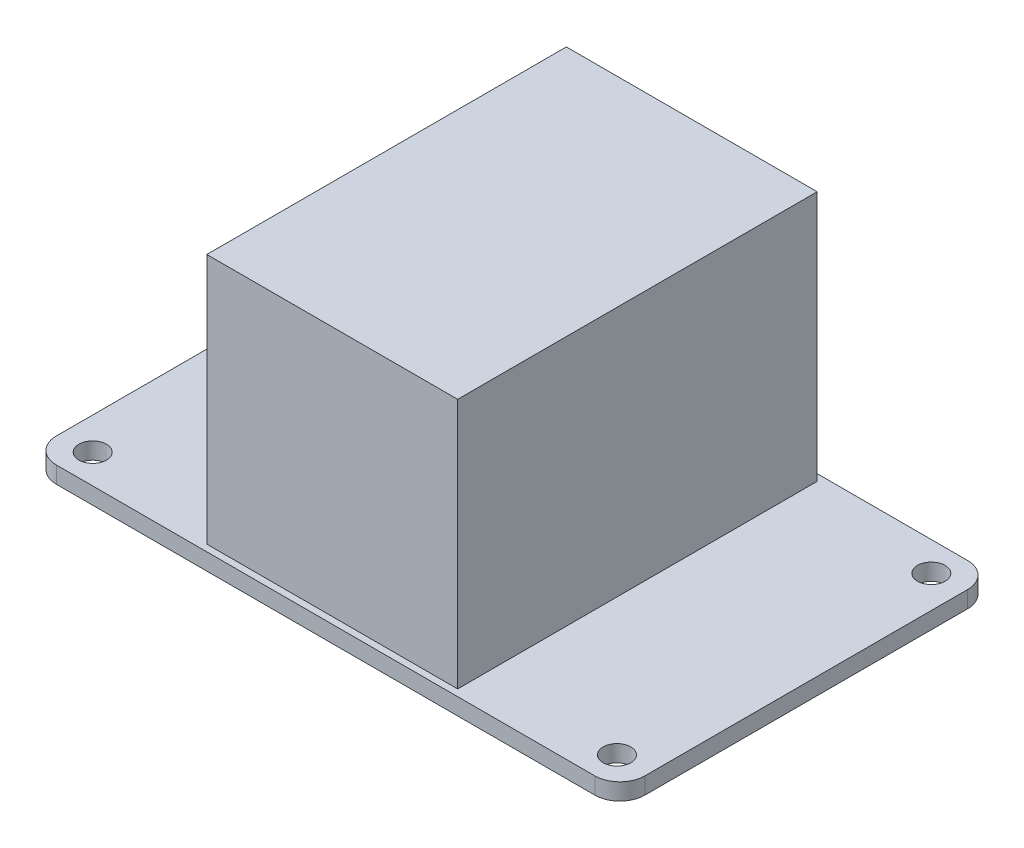
ISO-10303-21;
HEADER;
FILE_DESCRIPTION(('STEP AP214'),'2;1');
FILE_NAME('part.step','',(''),(''),'','','');
FILE_SCHEMA(('AUTOMOTIVE_DESIGN { 1 0 10303 214 1 1 1 1 }'));
ENDSEC;
DATA;
#1=APPLICATION_CONTEXT('core data for automotive mechanical design processes');
#2=APPLICATION_PROTOCOL_DEFINITION('international standard','automotive_design',2000,#1);
#3=PRODUCT_CONTEXT('',#1,'mechanical');
#4=PRODUCT('Part','Part','',(#3));
#5=PRODUCT_RELATED_PRODUCT_CATEGORY('part','',(#4));
#6=PRODUCT_DEFINITION_FORMATION('','',#4);
#7=PRODUCT_DEFINITION_CONTEXT('part definition',#1,'design');
#8=PRODUCT_DEFINITION('design','',#6,#7);
#9=PRODUCT_DEFINITION_SHAPE('','',#8);
#10=(LENGTH_UNIT() NAMED_UNIT(*) SI_UNIT(.MILLI.,.METRE.));
#11=(NAMED_UNIT(*) PLANE_ANGLE_UNIT() SI_UNIT($,.RADIAN.));
#12=(NAMED_UNIT(*) SI_UNIT($,.STERADIAN.) SOLID_ANGLE_UNIT());
#13=UNCERTAINTY_MEASURE_WITH_UNIT(LENGTH_MEASURE(1.E-05),#10,'distance_accuracy_value','');
#14=(GEOMETRIC_REPRESENTATION_CONTEXT(3) GLOBAL_UNCERTAINTY_ASSIGNED_CONTEXT((#13)) GLOBAL_UNIT_ASSIGNED_CONTEXT((#10,
#11,#12)) REPRESENTATION_CONTEXT('',''));
#15=CARTESIAN_POINT('',(0.,0.,0.));
#16=DIRECTION('',(0.,0.,1.));
#17=DIRECTION('',(1.,0.,0.));
#18=AXIS2_PLACEMENT_3D('',#15,#16,#17);
#19=CARTESIAN_POINT('',(0.,2.,0.));
#20=DIRECTION('',(0.,-1.,0.));
#21=DIRECTION('',(0.,0.,-1.));
#22=AXIS2_PLACEMENT_3D('',#19,#20,#21);
#23=PLANE('',#22);
#24=DIRECTION('',(0.,0.,-1.));
#25=VECTOR('',#24,1.);
#26=CARTESIAN_POINT('',(35.2,2.,22.3));
#27=LINE('',#26,#25);
#28=CARTESIAN_POINT('',(35.2,2.,19.3));
#29=VERTEX_POINT('',#28);
#30=CARTESIAN_POINT('',(35.2,2.,-19.3));
#31=VERTEX_POINT('',#30);
#32=EDGE_CURVE('E179',#29,#31,#27,.T.);
#33=ORIENTED_EDGE('',*,*,#32,.T.);
#34=CARTESIAN_POINT('',(32.2,2.,-19.3));
#35=DIRECTION('',(0.,-1.,0.));
#36=DIRECTION('',(0.,0.,-1.));
#37=AXIS2_PLACEMENT_3D('',#34,#35,#36);
#38=CIRCLE('',#37,3.);
#39=CARTESIAN_POINT('',(32.2,2.,-22.3));
#40=VERTEX_POINT('',#39);
#41=EDGE_CURVE('E226',#31,#40,#38,.F.);
#42=ORIENTED_EDGE('',*,*,#41,.T.);
#43=DIRECTION('',(-1.,0.,0.));
#44=VECTOR('',#43,1.);
#45=CARTESIAN_POINT('',(-35.2,2.,-22.3));
#46=LINE('',#45,#44);
#47=CARTESIAN_POINT('',(-32.2,2.,-22.3));
#48=VERTEX_POINT('',#47);
#49=EDGE_CURVE('E182',#40,#48,#46,.T.);
#50=ORIENTED_EDGE('',*,*,#49,.T.);
#51=CARTESIAN_POINT('',(-32.2,2.,-19.3));
#52=DIRECTION('',(0.,-1.,0.));
#53=DIRECTION('',(0.,0.,-1.));
#54=AXIS2_PLACEMENT_3D('',#51,#52,#53);
#55=CIRCLE('',#54,3.);
#56=CARTESIAN_POINT('',(-35.2,2.,-19.3));
#57=VERTEX_POINT('',#56);
#58=EDGE_CURVE('E222',#48,#57,#55,.F.);
#59=ORIENTED_EDGE('',*,*,#58,.T.);
#60=DIRECTION('',(0.,0.,1.));
#61=VECTOR('',#60,1.);
#62=CARTESIAN_POINT('',(-35.2,2.,22.3));
#63=LINE('',#62,#61);
#64=CARTESIAN_POINT('',(-35.2,2.,19.3));
#65=VERTEX_POINT('',#64);
#66=EDGE_CURVE('E186',#57,#65,#63,.T.);
#67=ORIENTED_EDGE('',*,*,#66,.T.);
#68=CARTESIAN_POINT('',(-32.2,2.,19.3));
#69=DIRECTION('',(0.,-1.,0.));
#70=DIRECTION('',(0.,0.,-1.));
#71=AXIS2_PLACEMENT_3D('',#68,#69,#70);
#72=CIRCLE('',#71,3.);
#73=CARTESIAN_POINT('',(-32.2,2.,22.3));
#74=VERTEX_POINT('',#73);
#75=EDGE_CURVE('E220',#65,#74,#72,.F.);
#76=ORIENTED_EDGE('',*,*,#75,.T.);
#77=DIRECTION('',(1.,0.,0.));
#78=VECTOR('',#77,1.);
#79=CARTESIAN_POINT('',(-35.2,2.,22.3));
#80=LINE('',#79,#78);
#81=CARTESIAN_POINT('',(32.2,2.,22.3));
#82=VERTEX_POINT('',#81);
#83=EDGE_CURVE('E189',#74,#82,#80,.T.);
#84=ORIENTED_EDGE('',*,*,#83,.T.);
#85=CARTESIAN_POINT('',(32.2,2.,19.3));
#86=DIRECTION('',(0.,-1.,0.));
#87=DIRECTION('',(0.,0.,-1.));
#88=AXIS2_PLACEMENT_3D('',#85,#86,#87);
#89=CIRCLE('',#88,3.);
#90=EDGE_CURVE('E224',#82,#29,#89,.F.);
#91=ORIENTED_EDGE('',*,*,#90,.T.);
#92=EDGE_LOOP('',(#33,#42,#50,#59,#67,#76,#84,#91));
#93=FACE_BOUND('',#92,.T.);
#94=CARTESIAN_POINT('',(-31.35,2.,-18.8));
#95=DIRECTION('',(0.,1.,0.));
#96=DIRECTION('',(0.,0.,1.));
#97=AXIS2_PLACEMENT_3D('',#94,#95,#96);
#98=CIRCLE('',#97,1.65);
#99=CARTESIAN_POINT('',(-31.35,2.,-17.15));
#100=VERTEX_POINT('',#99);
#101=EDGE_CURVE('E161',#100,#100,#98,.T.);
#102=ORIENTED_EDGE('',*,*,#101,.F.);
#103=EDGE_LOOP('',(#102));
#104=FACE_BOUND('',#103,.T.);
#105=CARTESIAN_POINT('',(31.35,2.,-18.8));
#106=DIRECTION('',(0.,1.,0.));
#107=DIRECTION('',(0.,0.,1.));
#108=AXIS2_PLACEMENT_3D('',#105,#106,#107);
#109=CIRCLE('',#108,1.65);
#110=CARTESIAN_POINT('',(31.35,2.,-17.15));
#111=VERTEX_POINT('',#110);
#112=EDGE_CURVE('E162',#111,#111,#109,.T.);
#113=ORIENTED_EDGE('',*,*,#112,.F.);
#114=EDGE_LOOP('',(#113));
#115=FACE_BOUND('',#114,.T.);
#116=CARTESIAN_POINT('',(31.35,2.,18.8));
#117=DIRECTION('',(0.,1.,0.));
#118=DIRECTION('',(0.,0.,1.));
#119=AXIS2_PLACEMENT_3D('',#116,#117,#118);
#120=CIRCLE('',#119,1.65);
#121=CARTESIAN_POINT('',(31.35,2.,20.45));
#122=VERTEX_POINT('',#121);
#123=EDGE_CURVE('E168',#122,#122,#120,.T.);
#124=ORIENTED_EDGE('',*,*,#123,.F.);
#125=EDGE_LOOP('',(#124));
#126=FACE_BOUND('',#125,.T.);
#127=CARTESIAN_POINT('',(-31.35,2.,18.8));
#128=DIRECTION('',(0.,1.,0.));
#129=DIRECTION('',(0.,0.,1.));
#130=AXIS2_PLACEMENT_3D('',#127,#128,#129);
#131=CIRCLE('',#130,1.65);
#132=CARTESIAN_POINT('',(-31.35,2.,20.45));
#133=VERTEX_POINT('',#132);
#134=EDGE_CURVE('E149',#133,#133,#131,.T.);
#135=ORIENTED_EDGE('',*,*,#134,.F.);
#136=EDGE_LOOP('',(#135));
#137=FACE_BOUND('',#136,.T.);
#138=DIRECTION('',(0.,0.,-1.));
#139=VECTOR('',#138,1.);
#140=CARTESIAN_POINT('',(15.,2.,21.5));
#141=LINE('',#140,#139);
#142=CARTESIAN_POINT('',(15.,2.,21.5));
#143=VERTEX_POINT('',#142);
#144=CARTESIAN_POINT('',(15.,2.,-21.5));
#145=VERTEX_POINT('',#144);
#146=EDGE_CURVE('E148',#143,#145,#141,.T.);
#147=ORIENTED_EDGE('',*,*,#146,.F.);
#148=DIRECTION('',(1.,0.,0.));
#149=VECTOR('',#148,1.);
#150=CARTESIAN_POINT('',(-15.,2.,21.5));
#151=LINE('',#150,#149);
#152=CARTESIAN_POINT('',(-15.,2.,21.5));
#153=VERTEX_POINT('',#152);
#154=EDGE_CURVE('E145',#153,#143,#151,.T.);
#155=ORIENTED_EDGE('',*,*,#154,.F.);
#156=DIRECTION('',(0.,0.,1.));
#157=VECTOR('',#156,1.);
#158=CARTESIAN_POINT('',(-15.,2.,21.5));
#159=LINE('',#158,#157);
#160=CARTESIAN_POINT('',(-15.,2.,-21.5));
#161=VERTEX_POINT('',#160);
#162=EDGE_CURVE('E59',#161,#153,#159,.T.);
#163=ORIENTED_EDGE('',*,*,#162,.F.);
#164=DIRECTION('',(-1.,0.,0.));
#165=VECTOR('',#164,1.);
#166=CARTESIAN_POINT('',(-15.,2.,-21.5));
#167=LINE('',#166,#165);
#168=EDGE_CURVE('E54',#145,#161,#167,.T.);
#169=ORIENTED_EDGE('',*,*,#168,.F.);
#170=EDGE_LOOP('',(#147,#155,#163,#169));
#171=FACE_BOUND('',#170,.T.);
#172=ADVANCED_FACE('F39',(#93,#104,#115,#126,#137,#171),#23,.F.);
#173=CARTESIAN_POINT('',(35.2,2.,22.3));
#174=DIRECTION('',(-1.,0.,0.));
#175=DIRECTION('',(0.,0.,1.));
#176=AXIS2_PLACEMENT_3D('',#173,#174,#175);
#177=PLANE('',#176);
#178=DIRECTION('',(0.,0.,-1.));
#179=VECTOR('',#178,1.);
#180=CARTESIAN_POINT('',(35.2,0.,22.3));
#181=LINE('',#180,#179);
#182=CARTESIAN_POINT('',(35.2,0.,19.3));
#183=VERTEX_POINT('',#182);
#184=CARTESIAN_POINT('',(35.2,0.,-19.3));
#185=VERTEX_POINT('',#184);
#186=EDGE_CURVE('E176',#183,#185,#181,.T.);
#187=ORIENTED_EDGE('',*,*,#186,.T.);
#188=DIRECTION('',(0.,-1.,0.));
#189=VECTOR('',#188,1.);
#190=CARTESIAN_POINT('',(35.2,2.,-19.3));
#191=LINE('',#190,#189);
#192=EDGE_CURVE('E218',#185,#31,#191,.F.);
#193=ORIENTED_EDGE('',*,*,#192,.T.);
#194=ORIENTED_EDGE('',*,*,#32,.F.);
#195=DIRECTION('',(0.,-1.,0.));
#196=VECTOR('',#195,1.);
#197=CARTESIAN_POINT('',(35.2,2.,19.3));
#198=LINE('',#197,#196);
#199=EDGE_CURVE('E215',#29,#183,#198,.T.);
#200=ORIENTED_EDGE('',*,*,#199,.T.);
#201=EDGE_LOOP('',(#187,#193,#194,#200));
#202=FACE_BOUND('',#201,.T.);
#203=ADVANCED_FACE('F259',(#202),#177,.F.);
#204=CARTESIAN_POINT('',(-35.2,2.,-22.3));
#205=DIRECTION('',(0.,0.,1.));
#206=DIRECTION('',(1.,0.,0.));
#207=AXIS2_PLACEMENT_3D('',#204,#205,#206);
#208=PLANE('',#207);
#209=ORIENTED_EDGE('',*,*,#49,.F.);
#210=DIRECTION('',(0.,-1.,0.));
#211=VECTOR('',#210,1.);
#212=CARTESIAN_POINT('',(32.2,2.,-22.3));
#213=LINE('',#212,#211);
#214=CARTESIAN_POINT('',(32.2,0.,-22.3));
#215=VERTEX_POINT('',#214);
#216=EDGE_CURVE('E204',#40,#215,#213,.T.);
#217=ORIENTED_EDGE('',*,*,#216,.T.);
#218=DIRECTION('',(-1.,0.,0.));
#219=VECTOR('',#218,1.);
#220=CARTESIAN_POINT('',(-35.2,0.,-22.3));
#221=LINE('',#220,#219);
#222=CARTESIAN_POINT('',(-32.2,0.,-22.3));
#223=VERTEX_POINT('',#222);
#224=EDGE_CURVE('E195',#215,#223,#221,.T.);
#225=ORIENTED_EDGE('',*,*,#224,.T.);
#226=DIRECTION('',(0.,-1.,0.));
#227=VECTOR('',#226,1.);
#228=CARTESIAN_POINT('',(-32.2,2.,-22.3));
#229=LINE('',#228,#227);
#230=EDGE_CURVE('E192',#223,#48,#229,.F.);
#231=ORIENTED_EDGE('',*,*,#230,.T.);
#232=EDGE_LOOP('',(#209,#217,#225,#231));
#233=FACE_BOUND('',#232,.T.);
#234=ADVANCED_FACE('F267',(#233),#208,.F.);
#235=CARTESIAN_POINT('',(-35.2,2.,22.3));
#236=DIRECTION('',(1.,0.,0.));
#237=DIRECTION('',(0.,0.,-1.));
#238=AXIS2_PLACEMENT_3D('',#235,#236,#237);
#239=PLANE('',#238);
#240=ORIENTED_EDGE('',*,*,#66,.F.);
#241=DIRECTION('',(0.,-1.,0.));
#242=VECTOR('',#241,1.);
#243=CARTESIAN_POINT('',(-35.2,2.,-19.3));
#244=LINE('',#243,#242);
#245=CARTESIAN_POINT('',(-35.2,0.,-19.3));
#246=VERTEX_POINT('',#245);
#247=EDGE_CURVE('E11',#57,#246,#244,.T.);
#248=ORIENTED_EDGE('',*,*,#247,.T.);
#249=DIRECTION('',(0.,0.,1.));
#250=VECTOR('',#249,1.);
#251=CARTESIAN_POINT('',(-35.2,0.,22.3));
#252=LINE('',#251,#250);
#253=CARTESIAN_POINT('',(-35.2,0.,19.3));
#254=VERTEX_POINT('',#253);
#255=EDGE_CURVE('E198',#246,#254,#252,.T.);
#256=ORIENTED_EDGE('',*,*,#255,.T.);
#257=DIRECTION('',(0.,-1.,0.));
#258=VECTOR('',#257,1.);
#259=CARTESIAN_POINT('',(-35.2,2.,19.3));
#260=LINE('',#259,#258);
#261=EDGE_CURVE('E47',#254,#65,#260,.F.);
#262=ORIENTED_EDGE('',*,*,#261,.T.);
#263=EDGE_LOOP('',(#240,#248,#256,#262));
#264=FACE_BOUND('',#263,.T.);
#265=ADVANCED_FACE('F235',(#264),#239,.F.);
#266=CARTESIAN_POINT('',(-35.2,2.,22.3));
#267=DIRECTION('',(0.,0.,-1.));
#268=DIRECTION('',(-1.,0.,0.));
#269=AXIS2_PLACEMENT_3D('',#266,#267,#268);
#270=PLANE('',#269);
#271=DIRECTION('',(1.,0.,0.));
#272=VECTOR('',#271,1.);
#273=CARTESIAN_POINT('',(-35.2,0.,22.3));
#274=LINE('',#273,#272);
#275=CARTESIAN_POINT('',(-32.2,0.,22.3));
#276=VERTEX_POINT('',#275);
#277=CARTESIAN_POINT('',(32.2,0.,22.3));
#278=VERTEX_POINT('',#277);
#279=EDGE_CURVE('E183',#276,#278,#274,.T.);
#280=ORIENTED_EDGE('',*,*,#279,.T.);
#281=DIRECTION('',(0.,-1.,0.));
#282=VECTOR('',#281,1.);
#283=CARTESIAN_POINT('',(32.2,2.,22.3));
#284=LINE('',#283,#282);
#285=EDGE_CURVE('E231',#278,#82,#284,.F.);
#286=ORIENTED_EDGE('',*,*,#285,.T.);
#287=ORIENTED_EDGE('',*,*,#83,.F.);
#288=DIRECTION('',(0.,-1.,0.));
#289=VECTOR('',#288,1.);
#290=CARTESIAN_POINT('',(-32.2,2.,22.3));
#291=LINE('',#290,#289);
#292=EDGE_CURVE('E228',#74,#276,#291,.T.);
#293=ORIENTED_EDGE('',*,*,#292,.T.);
#294=EDGE_LOOP('',(#280,#286,#287,#293));
#295=FACE_BOUND('',#294,.T.);
#296=ADVANCED_FACE('F247',(#295),#270,.F.);
#297=CARTESIAN_POINT('',(0.,0.,0.));
#298=DIRECTION('',(0.,-1.,0.));
#299=DIRECTION('',(0.,0.,-1.));
#300=AXIS2_PLACEMENT_3D('',#297,#298,#299);
#301=PLANE('',#300);
#302=CARTESIAN_POINT('',(-31.35,0.,18.8));
#303=DIRECTION('',(0.,1.,0.));
#304=DIRECTION('',(0.,0.,1.));
#305=AXIS2_PLACEMENT_3D('',#302,#303,#304);
#306=CIRCLE('',#305,1.65);
#307=CARTESIAN_POINT('',(-31.35,0.,20.45));
#308=VERTEX_POINT('',#307);
#309=EDGE_CURVE('E152',#308,#308,#306,.T.);
#310=ORIENTED_EDGE('',*,*,#309,.T.);
#311=EDGE_LOOP('',(#310));
#312=FACE_BOUND('',#311,.T.);
#313=CARTESIAN_POINT('',(31.35,0.,18.8));
#314=DIRECTION('',(0.,1.,0.));
#315=DIRECTION('',(0.,0.,1.));
#316=AXIS2_PLACEMENT_3D('',#313,#314,#315);
#317=CIRCLE('',#316,1.65);
#318=CARTESIAN_POINT('',(31.35,0.,20.45));
#319=VERTEX_POINT('',#318);
#320=EDGE_CURVE('E165',#319,#319,#317,.T.);
#321=ORIENTED_EDGE('',*,*,#320,.T.);
#322=EDGE_LOOP('',(#321));
#323=FACE_BOUND('',#322,.T.);
#324=CARTESIAN_POINT('',(31.35,0.,-18.8));
#325=DIRECTION('',(0.,1.,0.));
#326=DIRECTION('',(0.,0.,1.));
#327=AXIS2_PLACEMENT_3D('',#324,#325,#326);
#328=CIRCLE('',#327,1.65);
#329=CARTESIAN_POINT('',(31.35,0.,-17.15));
#330=VERTEX_POINT('',#329);
#331=EDGE_CURVE('E158',#330,#330,#328,.T.);
#332=ORIENTED_EDGE('',*,*,#331,.T.);
#333=EDGE_LOOP('',(#332));
#334=FACE_BOUND('',#333,.T.);
#335=CARTESIAN_POINT('',(-31.35,0.,-18.8));
#336=DIRECTION('',(0.,1.,0.));
#337=DIRECTION('',(0.,0.,1.));
#338=AXIS2_PLACEMENT_3D('',#335,#336,#337);
#339=CIRCLE('',#338,1.65);
#340=CARTESIAN_POINT('',(-31.35,0.,-17.15));
#341=VERTEX_POINT('',#340);
#342=EDGE_CURVE('E173',#341,#341,#339,.T.);
#343=ORIENTED_EDGE('',*,*,#342,.T.);
#344=EDGE_LOOP('',(#343));
#345=FACE_BOUND('',#344,.T.);
#346=ORIENTED_EDGE('',*,*,#224,.F.);
#347=CARTESIAN_POINT('',(32.2,0.,-19.3));
#348=DIRECTION('',(0.,-1.,0.));
#349=DIRECTION('',(0.,0.,-1.));
#350=AXIS2_PLACEMENT_3D('',#347,#348,#349);
#351=CIRCLE('',#350,3.);
#352=EDGE_CURVE('E213',#215,#185,#351,.T.);
#353=ORIENTED_EDGE('',*,*,#352,.T.);
#354=ORIENTED_EDGE('',*,*,#186,.F.);
#355=CARTESIAN_POINT('',(32.2,0.,19.3));
#356=DIRECTION('',(0.,-1.,0.));
#357=DIRECTION('',(0.,0.,-1.));
#358=AXIS2_PLACEMENT_3D('',#355,#356,#357);
#359=CIRCLE('',#358,3.);
#360=EDGE_CURVE('E211',#183,#278,#359,.T.);
#361=ORIENTED_EDGE('',*,*,#360,.T.);
#362=ORIENTED_EDGE('',*,*,#279,.F.);
#363=CARTESIAN_POINT('',(-32.2,0.,19.3));
#364=DIRECTION('',(0.,-1.,0.));
#365=DIRECTION('',(0.,0.,-1.));
#366=AXIS2_PLACEMENT_3D('',#363,#364,#365);
#367=CIRCLE('',#366,3.);
#368=EDGE_CURVE('E207',#276,#254,#367,.T.);
#369=ORIENTED_EDGE('',*,*,#368,.T.);
#370=ORIENTED_EDGE('',*,*,#255,.F.);
#371=CARTESIAN_POINT('',(-32.2,0.,-19.3));
#372=DIRECTION('',(0.,-1.,0.));
#373=DIRECTION('',(0.,0.,-1.));
#374=AXIS2_PLACEMENT_3D('',#371,#372,#373);
#375=CIRCLE('',#374,3.);
#376=EDGE_CURVE('E209',#246,#223,#375,.T.);
#377=ORIENTED_EDGE('',*,*,#376,.T.);
#378=EDGE_LOOP('',(#346,#353,#354,#361,#362,#369,#370,#377));
#379=FACE_BOUND('',#378,.T.);
#380=ADVANCED_FACE('F251',(#312,#323,#334,#345,#379),#301,.T.);
#381=CARTESIAN_POINT('',(-31.35,0.,-18.8));
#382=DIRECTION('',(0.,1.,0.));
#383=DIRECTION('',(0.,0.,1.));
#384=AXIS2_PLACEMENT_3D('',#381,#382,#383);
#385=CYLINDRICAL_SURFACE('',#384,1.65);
#386=ORIENTED_EDGE('',*,*,#342,.F.);
#387=EDGE_LOOP('',(#386));
#388=FACE_BOUND('',#387,.T.);
#389=ORIENTED_EDGE('',*,*,#101,.T.);
#390=EDGE_LOOP('',(#389));
#391=FACE_BOUND('',#390,.T.);
#392=ADVANCED_FACE('F286',(#388,#391),#385,.F.);
#393=CARTESIAN_POINT('',(31.35,0.,-18.8));
#394=DIRECTION('',(0.,1.,0.));
#395=DIRECTION('',(0.,0.,1.));
#396=AXIS2_PLACEMENT_3D('',#393,#394,#395);
#397=CYLINDRICAL_SURFACE('',#396,1.65);
#398=ORIENTED_EDGE('',*,*,#331,.F.);
#399=EDGE_LOOP('',(#398));
#400=FACE_BOUND('',#399,.T.);
#401=ORIENTED_EDGE('',*,*,#112,.T.);
#402=EDGE_LOOP('',(#401));
#403=FACE_BOUND('',#402,.T.);
#404=ADVANCED_FACE('F307',(#400,#403),#397,.F.);
#405=CARTESIAN_POINT('',(31.35,0.,18.8));
#406=DIRECTION('',(0.,1.,0.));
#407=DIRECTION('',(0.,0.,1.));
#408=AXIS2_PLACEMENT_3D('',#405,#406,#407);
#409=CYLINDRICAL_SURFACE('',#408,1.65);
#410=ORIENTED_EDGE('',*,*,#320,.F.);
#411=EDGE_LOOP('',(#410));
#412=FACE_BOUND('',#411,.T.);
#413=ORIENTED_EDGE('',*,*,#123,.T.);
#414=EDGE_LOOP('',(#413));
#415=FACE_BOUND('',#414,.T.);
#416=ADVANCED_FACE('F302',(#412,#415),#409,.F.);
#417=CARTESIAN_POINT('',(-31.35,0.,18.8));
#418=DIRECTION('',(0.,1.,0.));
#419=DIRECTION('',(0.,0.,1.));
#420=AXIS2_PLACEMENT_3D('',#417,#418,#419);
#421=CYLINDRICAL_SURFACE('',#420,1.65);
#422=ORIENTED_EDGE('',*,*,#309,.F.);
#423=EDGE_LOOP('',(#422));
#424=FACE_BOUND('',#423,.T.);
#425=ORIENTED_EDGE('',*,*,#134,.T.);
#426=EDGE_LOOP('',(#425));
#427=FACE_BOUND('',#426,.T.);
#428=ADVANCED_FACE('F298',(#424,#427),#421,.F.);
#429=CARTESIAN_POINT('',(32.2,2.,-19.3));
#430=DIRECTION('',(0.,-1.,0.));
#431=DIRECTION('',(0.,0.,-1.));
#432=AXIS2_PLACEMENT_3D('',#429,#430,#431);
#433=CYLINDRICAL_SURFACE('',#432,3.);
#434=ORIENTED_EDGE('',*,*,#41,.F.);
#435=ORIENTED_EDGE('',*,*,#192,.F.);
#436=ORIENTED_EDGE('',*,*,#352,.F.);
#437=ORIENTED_EDGE('',*,*,#216,.F.);
#438=EDGE_LOOP('',(#434,#435,#436,#437));
#439=FACE_BOUND('',#438,.T.);
#440=ADVANCED_FACE('F265',(#439),#433,.T.);
#441=CARTESIAN_POINT('',(32.2,2.,19.3));
#442=DIRECTION('',(0.,-1.,0.));
#443=DIRECTION('',(0.,0.,-1.));
#444=AXIS2_PLACEMENT_3D('',#441,#442,#443);
#445=CYLINDRICAL_SURFACE('',#444,3.);
#446=ORIENTED_EDGE('',*,*,#90,.F.);
#447=ORIENTED_EDGE('',*,*,#285,.F.);
#448=ORIENTED_EDGE('',*,*,#360,.F.);
#449=ORIENTED_EDGE('',*,*,#199,.F.);
#450=EDGE_LOOP('',(#446,#447,#448,#449));
#451=FACE_BOUND('',#450,.T.);
#452=ADVANCED_FACE('F256',(#451),#445,.T.);
#453=CARTESIAN_POINT('',(-32.2,2.,-19.3));
#454=DIRECTION('',(0.,-1.,0.));
#455=DIRECTION('',(0.,0.,-1.));
#456=AXIS2_PLACEMENT_3D('',#453,#454,#455);
#457=CYLINDRICAL_SURFACE('',#456,3.);
#458=ORIENTED_EDGE('',*,*,#58,.F.);
#459=ORIENTED_EDGE('',*,*,#230,.F.);
#460=ORIENTED_EDGE('',*,*,#376,.F.);
#461=ORIENTED_EDGE('',*,*,#247,.F.);
#462=EDGE_LOOP('',(#458,#459,#460,#461));
#463=FACE_BOUND('',#462,.T.);
#464=ADVANCED_FACE('F270',(#463),#457,.T.);
#465=CARTESIAN_POINT('',(-32.2,2.,19.3));
#466=DIRECTION('',(0.,-1.,0.));
#467=DIRECTION('',(0.,0.,-1.));
#468=AXIS2_PLACEMENT_3D('',#465,#466,#467);
#469=CYLINDRICAL_SURFACE('',#468,3.);
#470=ORIENTED_EDGE('',*,*,#75,.F.);
#471=ORIENTED_EDGE('',*,*,#261,.F.);
#472=ORIENTED_EDGE('',*,*,#368,.F.);
#473=ORIENTED_EDGE('',*,*,#292,.F.);
#474=EDGE_LOOP('',(#470,#471,#472,#473));
#475=FACE_BOUND('',#474,.T.);
#476=ADVANCED_FACE('F41',(#475),#469,.T.);
#477=CARTESIAN_POINT('',(15.,32.,21.5));
#478=DIRECTION('',(-1.,0.,0.));
#479=DIRECTION('',(0.,0.,1.));
#480=AXIS2_PLACEMENT_3D('',#477,#478,#479);
#481=PLANE('',#480);
#482=ORIENTED_EDGE('',*,*,#146,.T.);
#483=DIRECTION('',(0.,-1.,0.));
#484=VECTOR('',#483,1.);
#485=CARTESIAN_POINT('',(15.,32.,-21.5));
#486=LINE('',#485,#484);
#487=CARTESIAN_POINT('',(15.,32.,-21.5));
#488=VERTEX_POINT('',#487);
#489=EDGE_CURVE('E129',#488,#145,#486,.T.);
#490=ORIENTED_EDGE('',*,*,#489,.F.);
#491=DIRECTION('',(0.,0.,-1.));
#492=VECTOR('',#491,1.);
#493=CARTESIAN_POINT('',(15.,32.,21.5));
#494=LINE('',#493,#492);
#495=CARTESIAN_POINT('',(15.,32.,21.5));
#496=VERTEX_POINT('',#495);
#497=EDGE_CURVE('E136',#496,#488,#494,.T.);
#498=ORIENTED_EDGE('',*,*,#497,.F.);
#499=DIRECTION('',(0.,-1.,0.));
#500=VECTOR('',#499,1.);
#501=CARTESIAN_POINT('',(15.,32.,21.5));
#502=LINE('',#501,#500);
#503=EDGE_CURVE('E444',#496,#143,#502,.T.);
#504=ORIENTED_EDGE('',*,*,#503,.T.);
#505=EDGE_LOOP('',(#482,#490,#498,#504));
#506=FACE_BOUND('',#505,.T.);
#507=ADVANCED_FACE('F147',(#506),#481,.F.);
#508=CARTESIAN_POINT('',(-15.,32.,-21.5));
#509=DIRECTION('',(0.,0.,1.));
#510=DIRECTION('',(1.,0.,0.));
#511=AXIS2_PLACEMENT_3D('',#508,#509,#510);
#512=PLANE('',#511);
#513=ORIENTED_EDGE('',*,*,#168,.T.);
#514=DIRECTION('',(0.,-1.,0.));
#515=VECTOR('',#514,1.);
#516=CARTESIAN_POINT('',(-15.,32.,-21.5));
#517=LINE('',#516,#515);
#518=CARTESIAN_POINT('',(-15.,32.,-21.5));
#519=VERTEX_POINT('',#518);
#520=EDGE_CURVE('E132',#519,#161,#517,.T.);
#521=ORIENTED_EDGE('',*,*,#520,.F.);
#522=DIRECTION('',(-1.,0.,0.));
#523=VECTOR('',#522,1.);
#524=CARTESIAN_POINT('',(-15.,32.,-21.5));
#525=LINE('',#524,#523);
#526=EDGE_CURVE('E125',#488,#519,#525,.T.);
#527=ORIENTED_EDGE('',*,*,#526,.F.);
#528=ORIENTED_EDGE('',*,*,#489,.T.);
#529=EDGE_LOOP('',(#513,#521,#527,#528));
#530=FACE_BOUND('',#529,.T.);
#531=ADVANCED_FACE('F127',(#530),#512,.F.);
#532=CARTESIAN_POINT('',(-15.,32.,21.5));
#533=DIRECTION('',(1.,0.,0.));
#534=DIRECTION('',(0.,0.,-1.));
#535=AXIS2_PLACEMENT_3D('',#532,#533,#534);
#536=PLANE('',#535);
#537=ORIENTED_EDGE('',*,*,#162,.T.);
#538=DIRECTION('',(0.,-1.,0.));
#539=VECTOR('',#538,1.);
#540=CARTESIAN_POINT('',(-15.,32.,21.5));
#541=LINE('',#540,#539);
#542=CARTESIAN_POINT('',(-15.,32.,21.5));
#543=VERTEX_POINT('',#542);
#544=EDGE_CURVE('E154',#543,#153,#541,.T.);
#545=ORIENTED_EDGE('',*,*,#544,.F.);
#546=DIRECTION('',(0.,0.,1.));
#547=VECTOR('',#546,1.);
#548=CARTESIAN_POINT('',(-15.,32.,21.5));
#549=LINE('',#548,#547);
#550=EDGE_CURVE('E135',#519,#543,#549,.T.);
#551=ORIENTED_EDGE('',*,*,#550,.F.);
#552=ORIENTED_EDGE('',*,*,#520,.T.);
#553=EDGE_LOOP('',(#537,#545,#551,#552));
#554=FACE_BOUND('',#553,.T.);
#555=ADVANCED_FACE('F319',(#554),#536,.F.);
#556=CARTESIAN_POINT('',(-15.,32.,21.5));
#557=DIRECTION('',(0.,0.,-1.));
#558=DIRECTION('',(-1.,0.,0.));
#559=AXIS2_PLACEMENT_3D('',#556,#557,#558);
#560=PLANE('',#559);
#561=ORIENTED_EDGE('',*,*,#154,.T.);
#562=ORIENTED_EDGE('',*,*,#503,.F.);
#563=DIRECTION('',(1.,0.,0.));
#564=VECTOR('',#563,1.);
#565=CARTESIAN_POINT('',(-15.,32.,21.5));
#566=LINE('',#565,#564);
#567=EDGE_CURVE('E141',#543,#496,#566,.T.);
#568=ORIENTED_EDGE('',*,*,#567,.F.);
#569=ORIENTED_EDGE('',*,*,#544,.T.);
#570=EDGE_LOOP('',(#561,#562,#568,#569));
#571=FACE_BOUND('',#570,.T.);
#572=ADVANCED_FACE('F322',(#571),#560,.F.);
#573=CARTESIAN_POINT('',(0.,32.,0.));
#574=DIRECTION('',(0.,-1.,0.));
#575=DIRECTION('',(0.,0.,-1.));
#576=AXIS2_PLACEMENT_3D('',#573,#574,#575);
#577=PLANE('',#576);
#578=ORIENTED_EDGE('',*,*,#497,.T.);
#579=ORIENTED_EDGE('',*,*,#526,.T.);
#580=ORIENTED_EDGE('',*,*,#550,.T.);
#581=ORIENTED_EDGE('',*,*,#567,.T.);
#582=EDGE_LOOP('',(#578,#579,#580,#581));
#583=FACE_BOUND('',#582,.T.);
#584=ADVANCED_FACE('F139',(#583),#577,.F.);
#585=CLOSED_SHELL('',(#172,#203,#234,#265,#296,#380,#392,#404,#416,#428,#440,#452,#464,#476,
#507,#531,#555,#572,#584));
#586=MANIFOLD_SOLID_BREP('B2',#585);
#587=ADVANCED_BREP_SHAPE_REPRESENTATION('',(#18,#586),#14);
#588=SHAPE_DEFINITION_REPRESENTATION(#9,#587);
ENDSEC;
END-ISO-10303-21;
